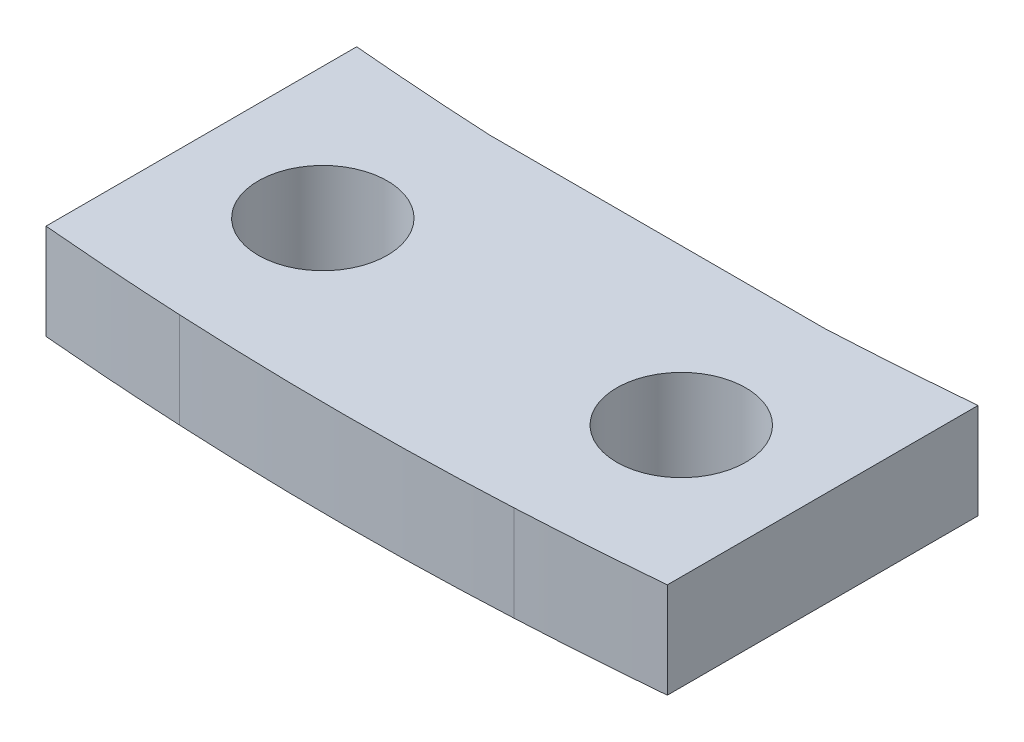
ISO-10303-21;
HEADER;
FILE_DESCRIPTION(('STEP AP214'),'2;1');
FILE_NAME('part.step','',(''),(''),'','','');
FILE_SCHEMA(('AUTOMOTIVE_DESIGN { 1 0 10303 214 1 1 1 1 }'));
ENDSEC;
DATA;
#1=APPLICATION_CONTEXT('core data for automotive mechanical design processes');
#2=APPLICATION_PROTOCOL_DEFINITION('international standard','automotive_design',2000,#1);
#3=PRODUCT_CONTEXT('',#1,'mechanical');
#4=PRODUCT('Part','Part','',(#3));
#5=PRODUCT_RELATED_PRODUCT_CATEGORY('part','',(#4));
#6=PRODUCT_DEFINITION_FORMATION('','',#4);
#7=PRODUCT_DEFINITION_CONTEXT('part definition',#1,'design');
#8=PRODUCT_DEFINITION('design','',#6,#7);
#9=PRODUCT_DEFINITION_SHAPE('','',#8);
#10=(LENGTH_UNIT() NAMED_UNIT(*) SI_UNIT(.MILLI.,.METRE.));
#11=(NAMED_UNIT(*) PLANE_ANGLE_UNIT() SI_UNIT($,.RADIAN.));
#12=(NAMED_UNIT(*) SI_UNIT($,.STERADIAN.) SOLID_ANGLE_UNIT());
#13=UNCERTAINTY_MEASURE_WITH_UNIT(LENGTH_MEASURE(1.E-05),#10,'distance_accuracy_value','');
#14=(GEOMETRIC_REPRESENTATION_CONTEXT(3) GLOBAL_UNCERTAINTY_ASSIGNED_CONTEXT((#13)) GLOBAL_UNIT_ASSIGNED_CONTEXT((#10,
#11,#12)) REPRESENTATION_CONTEXT('',''));
#15=CARTESIAN_POINT('',(0.,0.,0.));
#16=DIRECTION('',(0.,0.,1.));
#17=DIRECTION('',(1.,0.,0.));
#18=AXIS2_PLACEMENT_3D('',#15,#16,#17);
#19=CARTESIAN_POINT('',(10.0017972964317,4.,-6.68003144721731));
#20=DIRECTION('',(0.,-1.,0.));
#21=DIRECTION('',(0.,0.,-1.));
#22=AXIS2_PLACEMENT_3D('',#19,#20,#21);
#23=PLANE('',#22);
#24=CARTESIAN_POINT('',(-7.50000000000041,4.,2.53269627492614E-13));
#25=DIRECTION('',(0.,1.,0.));
#26=DIRECTION('',(0.,0.,1.));
#27=AXIS2_PLACEMENT_3D('',#24,#25,#26);
#28=CIRCLE('',#27,2.69999999999955);
#29=CARTESIAN_POINT('',(-7.50000000000041,4.,2.69999999999981));
#30=VERTEX_POINT('',#29);
#31=EDGE_CURVE('E213',#30,#30,#28,.T.);
#32=ORIENTED_EDGE('',*,*,#31,.F.);
#33=EDGE_LOOP('',(#32));
#34=FACE_BOUND('',#33,.T.);
#35=CARTESIAN_POINT('',(12.9999999999984,4.,-6.91659883285647));
#36=CARTESIAN_POINT('',(11.0025987207417,4.,-6.74133582895095));
#37=CARTESIAN_POINT('',(9.00219406974415,4.,-6.5998817526765));
#38=CARTESIAN_POINT('',(6.99999999999775,4.,-6.49999999999968));
#39=B_SPLINE_CURVE_WITH_KNOTS('',3,(#35,#36,#37,#38),.UNSPECIFIED.,.F.,.F.,(4,4),
(0.769001891352631,1.),.UNSPECIFIED.);
#40=CARTESIAN_POINT('',(12.999999999999,4.,-6.91659883285647));
#41=VERTEX_POINT('',#40);
#42=CARTESIAN_POINT('',(6.99999999999867,4.,-6.49999999999976));
#43=VERTEX_POINT('',#42);
#44=EDGE_CURVE('E218',#41,#43,#39,.T.);
#45=ORIENTED_EDGE('',*,*,#44,.T.);
#46=DIRECTION('',(-1.,0.,0.));
#47=VECTOR('',#46,1.);
#48=CARTESIAN_POINT('',(6.99999999999867,4.,-6.49999999999976));
#49=LINE('',#48,#47);
#50=CARTESIAN_POINT('',(-6.99999999999859,4.,-6.49999999999968));
#51=VERTEX_POINT('',#50);
#52=EDGE_CURVE('E96',#43,#51,#49,.T.);
#53=ORIENTED_EDGE('',*,*,#52,.T.);
#54=CARTESIAN_POINT('',(-6.99999999999859,4.,-6.49999999999968));
#55=CARTESIAN_POINT('',(-9.00219406974498,4.,-6.5998817526765));
#56=CARTESIAN_POINT('',(-11.0025987207426,4.,-6.74133582895095));
#57=CARTESIAN_POINT('',(-12.9999999999993,4.,-6.91659883285647));
#58=B_SPLINE_CURVE_WITH_KNOTS('',3,(#54,#55,#56,#57),.UNSPECIFIED.,.F.,.F.,(4,4),
(1.4770263050022E-08,0.230998108647369),.UNSPECIFIED.);
#59=CARTESIAN_POINT('',(-12.9999996139171,4.,-6.91659883267888));
#60=VERTEX_POINT('',#59);
#61=EDGE_CURVE('E165',#51,#60,#58,.T.);
#62=ORIENTED_EDGE('',*,*,#61,.T.);
#63=DIRECTION('',(2.96987209127525E-08,0.,1.));
#64=VECTOR('',#63,1.);
#65=CARTESIAN_POINT('',(-12.9999996139171,4.,-6.91659883267888));
#66=LINE('',#65,#64);
#67=CARTESIAN_POINT('',(-12.9999992278337,4.,6.08340116746181));
#68=VERTEX_POINT('',#67);
#69=EDGE_CURVE('E160',#60,#68,#66,.T.);
#70=ORIENTED_EDGE('',*,*,#69,.T.);
#71=CARTESIAN_POINT('',(-12.9999992278337,4.,6.08340116746181));
#72=CARTESIAN_POINT('',(-12.1211629849976,4.,6.16051510618814));
#73=CARTESIAN_POINT('',(-10.1223810082019,4.,6.32090639475367));
#74=CARTESIAN_POINT('',(-8.12129399453965,4.,6.44406292196125));
#75=CARTESIAN_POINT('',(-6.99999922783445,4.,6.50000000031853));
#76=B_SPLINE_CURVE_WITH_KNOTS('',3,(#71,#72,#73,#74,#75),.UNSPECIFIED.,.F.,.F.,(4,1,4),(0.,
0.439999999999999,1.),.UNSPECIFIED.);
#77=CARTESIAN_POINT('',(-6.99999922783444,4.,6.50000000031854));
#78=VERTEX_POINT('',#77);
#79=EDGE_CURVE('E115',#68,#78,#76,.T.);
#80=ORIENTED_EDGE('',*,*,#79,.T.);
#81=CARTESIAN_POINT('',(-6.99999922783444,4.,6.50000000031854));
#82=CARTESIAN_POINT('',(-6.83482132536298,4.,6.50824258978432));
#83=CARTESIAN_POINT('',(-6.66657307013336,4.,6.51634167540092));
#84=CARTESIAN_POINT('',(-5.63247488113234,4.,6.56436245256432));
#85=CARTESIAN_POINT('',(-3.7403630823661,4.,6.6350088470744));
#86=CARTESIAN_POINT('',(-1.57897075086815,4.,6.67211614631573));
#87=CARTESIAN_POINT('',(-0.278468619002596,4.,6.67607184916145));
#88=CARTESIAN_POINT('',(1.02095401136197,4.,6.67607223278273));
#89=CARTESIAN_POINT('',(3.1787726617458,4.,6.65206207836696));
#90=CARTESIAN_POINT('',(5.35042834294214,4.,6.57745990935546));
#91=CARTESIAN_POINT('',(6.6665669637553,4.,6.51634200508547));
#92=CARTESIAN_POINT('',(6.83481906783178,4.,6.50824274079084));
#93=CARTESIAN_POINT('',(7.00000000000037,4.,6.50000000000025));
#94=B_SPLINE_CURVE_WITH_KNOTS('',3,(#81,#82,#83,#84,#85,#86,#87,#88,#89,#90,#91,#92,#93),
.UNSPECIFIED.,.F.,.F.,(4,2,1,1,2,1,2,4),(0.,0.0364473066080108,0.22,0.44,0.499999692500397,
0.720000000000002,0.963552078392782,1.),.UNSPECIFIED.);
#95=CARTESIAN_POINT('',(6.99999999999921,4.,6.50000000003715));
#96=VERTEX_POINT('',#95);
#97=EDGE_CURVE('E109',#78,#96,#94,.T.);
#98=ORIENTED_EDGE('',*,*,#97,.T.);
#99=CARTESIAN_POINT('',(6.99999999999921,4.,6.50000000003715));
#100=CARTESIAN_POINT('',(7.88096539068741,4.,6.45605202885936));
#101=CARTESIAN_POINT('',(9.88237211618385,4.,6.3378784537996));
#102=CARTESIAN_POINT('',(11.881455283615,4.,6.18154844936751));
#103=CARTESIAN_POINT('',(12.9999999999984,4.,6.08340116718043));
#104=B_SPLINE_CURVE_WITH_KNOTS('',3,(#99,#100,#101,#102,#103),.UNSPECIFIED.,.F.,.F.,(4,1,4),(0.,
0.44,1.),.UNSPECIFIED.);
#105=CARTESIAN_POINT('',(12.9999999999996,4.,6.08340116714353));
#106=VERTEX_POINT('',#105);
#107=EDGE_CURVE('E113',#96,#106,#104,.T.);
#108=ORIENTED_EDGE('',*,*,#107,.T.);
#109=DIRECTION('',(0.,0.,-1.));
#110=VECTOR('',#109,1.);
#111=CARTESIAN_POINT('',(12.999999999999,4.,-6.91659883285647));
#112=LINE('',#111,#110);
#113=EDGE_CURVE('E53',#106,#41,#112,.T.);
#114=ORIENTED_EDGE('',*,*,#113,.T.);
#115=EDGE_LOOP('',(#45,#53,#62,#70,#80,#98,#108,#114));
#116=FACE_BOUND('',#115,.T.);
#117=CARTESIAN_POINT('',(7.49999999999959,4.,2.4980018054066E-13));
#118=DIRECTION('',(0.,1.,0.));
#119=DIRECTION('',(0.,0.,1.));
#120=AXIS2_PLACEMENT_3D('',#117,#118,#119);
#121=CIRCLE('',#120,2.69999999999956);
#122=CARTESIAN_POINT('',(7.49999999999959,4.,2.6999999999998));
#123=VERTEX_POINT('',#122);
#124=EDGE_CURVE('E204',#123,#123,#121,.T.);
#125=ORIENTED_EDGE('',*,*,#124,.F.);
#126=EDGE_LOOP('',(#125));
#127=FACE_BOUND('',#126,.T.);
#128=ADVANCED_FACE('F35',(#34,#116,#127),#23,.F.);
#129=CARTESIAN_POINT('',(10.0017972964317,0.,-6.68003144721731));
#130=DIRECTION('',(0.,-1.,0.));
#131=DIRECTION('',(0.,0.,-1.));
#132=AXIS2_PLACEMENT_3D('',#129,#130,#131);
#133=PLANE('',#132);
#134=CARTESIAN_POINT('',(-7.50000000000041,0.,2.53269627492614E-13));
#135=DIRECTION('',(0.,1.,0.));
#136=DIRECTION('',(0.,0.,1.));
#137=AXIS2_PLACEMENT_3D('',#134,#135,#136);
#138=CIRCLE('',#137,2.69999999999955);
#139=CARTESIAN_POINT('',(-7.50000000000041,0.,2.69999999999981));
#140=VERTEX_POINT('',#139);
#141=EDGE_CURVE('E210',#140,#140,#138,.T.);
#142=ORIENTED_EDGE('',*,*,#141,.T.);
#143=EDGE_LOOP('',(#142));
#144=FACE_BOUND('',#143,.T.);
#145=CARTESIAN_POINT('',(12.9999999999984,0.,-6.91659883285647));
#146=CARTESIAN_POINT('',(11.0025987207417,0.,-6.74133582895095));
#147=CARTESIAN_POINT('',(9.00219406974415,0.,-6.5998817526765));
#148=CARTESIAN_POINT('',(6.99999999999775,0.,-6.49999999999968));
#149=B_SPLINE_CURVE_WITH_KNOTS('',3,(#145,#146,#147,#148),.UNSPECIFIED.,.F.,.F.,(4,4),
(0.769001891352631,1.),.UNSPECIFIED.);
#150=CARTESIAN_POINT('',(12.999999999999,0.,-6.91659883285647));
#151=VERTEX_POINT('',#150);
#152=CARTESIAN_POINT('',(6.99999999999867,0.,-6.49999999999976));
#153=VERTEX_POINT('',#152);
#154=EDGE_CURVE('E216',#151,#153,#149,.T.);
#155=ORIENTED_EDGE('',*,*,#154,.F.);
#156=DIRECTION('',(0.,0.,-1.));
#157=VECTOR('',#156,1.);
#158=CARTESIAN_POINT('',(12.999999999999,0.,-6.91659883285647));
#159=LINE('',#158,#157);
#160=CARTESIAN_POINT('',(12.9999999999996,0.,6.08340116714353));
#161=VERTEX_POINT('',#160);
#162=EDGE_CURVE('E88',#161,#151,#159,.T.);
#163=ORIENTED_EDGE('',*,*,#162,.F.);
#164=CARTESIAN_POINT('',(6.99999999999921,0.,6.50000000003715));
#165=CARTESIAN_POINT('',(7.88096539068741,0.,6.45605202885936));
#166=CARTESIAN_POINT('',(9.88237211618385,0.,6.3378784537996));
#167=CARTESIAN_POINT('',(11.881455283615,0.,6.18154844936751));
#168=CARTESIAN_POINT('',(12.9999999999984,0.,6.08340116718043));
#169=B_SPLINE_CURVE_WITH_KNOTS('',3,(#164,#165,#166,#167,#168),.UNSPECIFIED.,.F.,.F.,(4,1,4),
(0.,0.44,1.),.UNSPECIFIED.);
#170=CARTESIAN_POINT('',(6.99999999999921,0.,6.50000000003715));
#171=VERTEX_POINT('',#170);
#172=EDGE_CURVE('E82',#171,#161,#169,.T.);
#173=ORIENTED_EDGE('',*,*,#172,.F.);
#174=CARTESIAN_POINT('',(-6.99999922783444,0.,6.50000000031854));
#175=CARTESIAN_POINT('',(-6.83482132536298,0.,6.50824258978432));
#176=CARTESIAN_POINT('',(-6.66657307013336,0.,6.51634167540092));
#177=CARTESIAN_POINT('',(-5.63247488113234,0.,6.56436245256432));
#178=CARTESIAN_POINT('',(-3.7403630823661,0.,6.6350088470744));
#179=CARTESIAN_POINT('',(-1.57897075086815,0.,6.67211614631573));
#180=CARTESIAN_POINT('',(-0.278468619002596,0.,6.67607184916145));
#181=CARTESIAN_POINT('',(1.02095401136197,0.,6.67607223278273));
#182=CARTESIAN_POINT('',(3.1787726617458,0.,6.65206207836696));
#183=CARTESIAN_POINT('',(5.35042834294214,0.,6.57745990935546));
#184=CARTESIAN_POINT('',(6.6665669637553,0.,6.51634200508547));
#185=CARTESIAN_POINT('',(6.83481906783178,0.,6.50824274079084));
#186=CARTESIAN_POINT('',(7.00000000000037,0.,6.50000000000025));
#187=B_SPLINE_CURVE_WITH_KNOTS('',3,(#174,#175,#176,#177,#178,#179,#180,#181,#182,#183,#184,
#185,#186),.UNSPECIFIED.,.F.,.F.,(4,2,1,1,2,1,2,4),(0.,0.0364473066080108,0.22,0.44,
0.499999692500397,0.720000000000002,0.963552078392782,1.),.UNSPECIFIED.);
#188=CARTESIAN_POINT('',(-6.99999922783444,0.,6.50000000031854));
#189=VERTEX_POINT('',#188);
#190=EDGE_CURVE('E123',#189,#171,#187,.T.);
#191=ORIENTED_EDGE('',*,*,#190,.F.);
#192=CARTESIAN_POINT('',(-12.9999992278337,0.,6.08340116746181));
#193=CARTESIAN_POINT('',(-12.1211629849976,0.,6.16051510618814));
#194=CARTESIAN_POINT('',(-10.1223810082019,0.,6.32090639475367));
#195=CARTESIAN_POINT('',(-8.12129399453965,0.,6.44406292196125));
#196=CARTESIAN_POINT('',(-6.99999922783445,0.,6.50000000031853));
#197=B_SPLINE_CURVE_WITH_KNOTS('',3,(#192,#193,#194,#195,#196),.UNSPECIFIED.,.F.,.F.,(4,1,4),
(0.,0.439999999999999,1.),.UNSPECIFIED.);
#198=CARTESIAN_POINT('',(-12.9999992278337,0.,6.08340116746181));
#199=VERTEX_POINT('',#198);
#200=EDGE_CURVE('E253',#199,#189,#197,.T.);
#201=ORIENTED_EDGE('',*,*,#200,.F.);
#202=DIRECTION('',(2.96987209127525E-08,0.,1.));
#203=VECTOR('',#202,1.);
#204=CARTESIAN_POINT('',(-12.9999996139171,0.,-6.91659883267888));
#205=LINE('',#204,#203);
#206=CARTESIAN_POINT('',(-12.9999996139171,0.,-6.91659883267888));
#207=VERTEX_POINT('',#206);
#208=EDGE_CURVE('E251',#207,#199,#205,.T.);
#209=ORIENTED_EDGE('',*,*,#208,.F.);
#210=CARTESIAN_POINT('',(-6.99999999999859,0.,-6.49999999999968));
#211=CARTESIAN_POINT('',(-9.00219406974498,0.,-6.5998817526765));
#212=CARTESIAN_POINT('',(-11.0025987207426,0.,-6.74133582895095));
#213=CARTESIAN_POINT('',(-12.9999999999993,0.,-6.91659883285647));
#214=B_SPLINE_CURVE_WITH_KNOTS('',3,(#210,#211,#212,#213),.UNSPECIFIED.,.F.,.F.,(4,4),
(1.4770263050022E-08,0.230998108647369),.UNSPECIFIED.);
#215=CARTESIAN_POINT('',(-6.99999999999859,0.,-6.49999999999968));
#216=VERTEX_POINT('',#215);
#217=EDGE_CURVE('E245',#216,#207,#214,.T.);
#218=ORIENTED_EDGE('',*,*,#217,.F.);
#219=DIRECTION('',(-1.,0.,0.));
#220=VECTOR('',#219,1.);
#221=CARTESIAN_POINT('',(6.99999999999867,0.,-6.49999999999976));
#222=LINE('',#221,#220);
#223=EDGE_CURVE('E249',#153,#216,#222,.T.);
#224=ORIENTED_EDGE('',*,*,#223,.F.);
#225=EDGE_LOOP('',(#155,#163,#173,#191,#201,#209,#218,#224));
#226=FACE_BOUND('',#225,.T.);
#227=CARTESIAN_POINT('',(7.49999999999959,0.,2.4980018054066E-13));
#228=DIRECTION('',(0.,1.,0.));
#229=DIRECTION('',(0.,0.,1.));
#230=AXIS2_PLACEMENT_3D('',#227,#228,#229);
#231=CIRCLE('',#230,2.69999999999956);
#232=CARTESIAN_POINT('',(7.49999999999959,0.,2.6999999999998));
#233=VERTEX_POINT('',#232);
#234=EDGE_CURVE('E207',#233,#233,#231,.T.);
#235=ORIENTED_EDGE('',*,*,#234,.T.);
#236=EDGE_LOOP('',(#235));
#237=FACE_BOUND('',#236,.T.);
#238=ADVANCED_FACE('F181',(#144,#226,#237),#133,.T.);
#239=DIRECTION('',(0.,-1.,0.));
#240=VECTOR('',#239,1.);
#241=SURFACE_OF_LINEAR_EXTRUSION('',#39,#240);
#242=ORIENTED_EDGE('',*,*,#154,.T.);
#243=DIRECTION('',(0.,-1.,0.));
#244=VECTOR('',#243,1.);
#245=CARTESIAN_POINT('',(6.99999999999867,4.,-6.49999999999976));
#246=LINE('',#245,#244);
#247=EDGE_CURVE('E11',#43,#153,#246,.T.);
#248=ORIENTED_EDGE('',*,*,#247,.F.);
#249=ORIENTED_EDGE('',*,*,#44,.F.);
#250=DIRECTION('',(0.,-1.,0.));
#251=VECTOR('',#250,1.);
#252=CARTESIAN_POINT('',(12.999999999999,4.,-6.91659883285647));
#253=LINE('',#252,#251);
#254=EDGE_CURVE('E129',#41,#151,#253,.T.);
#255=ORIENTED_EDGE('',*,*,#254,.T.);
#256=EDGE_LOOP('',(#242,#248,#249,#255));
#257=FACE_BOUND('',#256,.T.);
#258=ADVANCED_FACE('F37',(#257),#241,.F.);
#259=CARTESIAN_POINT('',(6.99999999999867,4.,-6.49999999999976));
#260=DIRECTION('',(0.,0.,1.));
#261=DIRECTION('',(1.,0.,0.));
#262=AXIS2_PLACEMENT_3D('',#259,#260,#261);
#263=PLANE('',#262);
#264=ORIENTED_EDGE('',*,*,#223,.T.);
#265=DIRECTION('',(0.,-1.,0.));
#266=VECTOR('',#265,1.);
#267=CARTESIAN_POINT('',(-6.99999999999859,4.,-6.49999999999968));
#268=LINE('',#267,#266);
#269=EDGE_CURVE('E45',#51,#216,#268,.T.);
#270=ORIENTED_EDGE('',*,*,#269,.F.);
#271=ORIENTED_EDGE('',*,*,#52,.F.);
#272=ORIENTED_EDGE('',*,*,#247,.T.);
#273=EDGE_LOOP('',(#264,#270,#271,#272));
#274=FACE_BOUND('',#273,.T.);
#275=ADVANCED_FACE('F175',(#274),#263,.F.);
#276=DIRECTION('',(0.,-1.,0.));
#277=VECTOR('',#276,1.);
#278=SURFACE_OF_LINEAR_EXTRUSION('',#58,#277);
#279=ORIENTED_EDGE('',*,*,#217,.T.);
#280=DIRECTION('',(0.,-1.,0.));
#281=VECTOR('',#280,1.);
#282=CARTESIAN_POINT('',(-12.9999996139171,4.,-6.91659883267888));
#283=LINE('',#282,#281);
#284=EDGE_CURVE('E239',#60,#207,#283,.T.);
#285=ORIENTED_EDGE('',*,*,#284,.F.);
#286=ORIENTED_EDGE('',*,*,#61,.F.);
#287=ORIENTED_EDGE('',*,*,#269,.T.);
#288=EDGE_LOOP('',(#279,#285,#286,#287));
#289=FACE_BOUND('',#288,.T.);
#290=ADVANCED_FACE('F173',(#289),#278,.F.);
#291=CARTESIAN_POINT('',(-12.9999996139171,4.,-6.91659883267888));
#292=DIRECTION('',(1.,0.,-2.96987209127525E-08));
#293=DIRECTION('',(-2.96987209127525E-08,0.,-1.));
#294=AXIS2_PLACEMENT_3D('',#291,#292,#293);
#295=PLANE('',#294);
#296=ORIENTED_EDGE('',*,*,#208,.T.);
#297=DIRECTION('',(0.,-1.,0.));
#298=VECTOR('',#297,1.);
#299=CARTESIAN_POINT('',(-12.9999992278337,4.,6.08340116746181));
#300=LINE('',#299,#298);
#301=EDGE_CURVE('E236',#68,#199,#300,.T.);
#302=ORIENTED_EDGE('',*,*,#301,.F.);
#303=ORIENTED_EDGE('',*,*,#69,.F.);
#304=ORIENTED_EDGE('',*,*,#284,.T.);
#305=EDGE_LOOP('',(#296,#302,#303,#304));
#306=FACE_BOUND('',#305,.T.);
#307=ADVANCED_FACE('F153',(#306),#295,.F.);
#308=DIRECTION('',(0.,-1.,0.));
#309=VECTOR('',#308,1.);
#310=SURFACE_OF_LINEAR_EXTRUSION('',#76,#309);
#311=ORIENTED_EDGE('',*,*,#200,.T.);
#312=DIRECTION('',(0.,-1.,0.));
#313=VECTOR('',#312,1.);
#314=CARTESIAN_POINT('',(-6.99999922783444,4.,6.50000000031854));
#315=LINE('',#314,#313);
#316=EDGE_CURVE('E124',#78,#189,#315,.T.);
#317=ORIENTED_EDGE('',*,*,#316,.F.);
#318=ORIENTED_EDGE('',*,*,#79,.F.);
#319=ORIENTED_EDGE('',*,*,#301,.T.);
#320=EDGE_LOOP('',(#311,#317,#318,#319));
#321=FACE_BOUND('',#320,.T.);
#322=ADVANCED_FACE('F150',(#321),#310,.F.);
#323=DIRECTION('',(0.,-1.,0.));
#324=VECTOR('',#323,1.);
#325=SURFACE_OF_LINEAR_EXTRUSION('',#94,#324);
#326=ORIENTED_EDGE('',*,*,#190,.T.);
#327=DIRECTION('',(0.,-1.,0.));
#328=VECTOR('',#327,1.);
#329=CARTESIAN_POINT('',(6.99999999999921,4.,6.50000000003715));
#330=LINE('',#329,#328);
#331=EDGE_CURVE('E120',#96,#171,#330,.T.);
#332=ORIENTED_EDGE('',*,*,#331,.F.);
#333=ORIENTED_EDGE('',*,*,#97,.F.);
#334=ORIENTED_EDGE('',*,*,#316,.T.);
#335=EDGE_LOOP('',(#326,#332,#333,#334));
#336=FACE_BOUND('',#335,.T.);
#337=ADVANCED_FACE('F121',(#336),#325,.F.);
#338=DIRECTION('',(0.,-1.,0.));
#339=VECTOR('',#338,1.);
#340=SURFACE_OF_LINEAR_EXTRUSION('',#104,#339);
#341=ORIENTED_EDGE('',*,*,#172,.T.);
#342=DIRECTION('',(0.,-1.,0.));
#343=VECTOR('',#342,1.);
#344=CARTESIAN_POINT('',(12.9999999999996,4.,6.08340116714353));
#345=LINE('',#344,#343);
#346=EDGE_CURVE('E125',#106,#161,#345,.T.);
#347=ORIENTED_EDGE('',*,*,#346,.F.);
#348=ORIENTED_EDGE('',*,*,#107,.F.);
#349=ORIENTED_EDGE('',*,*,#331,.T.);
#350=EDGE_LOOP('',(#341,#347,#348,#349));
#351=FACE_BOUND('',#350,.T.);
#352=ADVANCED_FACE('F127',(#351),#340,.F.);
#353=CARTESIAN_POINT('',(12.999999999999,4.,-6.91659883285647));
#354=DIRECTION('',(-1.,0.,0.));
#355=DIRECTION('',(0.,0.,1.));
#356=AXIS2_PLACEMENT_3D('',#353,#354,#355);
#357=PLANE('',#356);
#358=ORIENTED_EDGE('',*,*,#162,.T.);
#359=ORIENTED_EDGE('',*,*,#254,.F.);
#360=ORIENTED_EDGE('',*,*,#113,.F.);
#361=ORIENTED_EDGE('',*,*,#346,.T.);
#362=EDGE_LOOP('',(#358,#359,#360,#361));
#363=FACE_BOUND('',#362,.T.);
#364=ADVANCED_FACE('F146',(#363),#357,.F.);
#365=CARTESIAN_POINT('',(-7.50000000000041,4.,2.53269627492614E-13));
#366=DIRECTION('',(0.,-1.,0.));
#367=DIRECTION('',(0.,0.,-1.));
#368=AXIS2_PLACEMENT_3D('',#365,#366,#367);
#369=CYLINDRICAL_SURFACE('',#368,2.69999999999955);
#370=ORIENTED_EDGE('',*,*,#31,.T.);
#371=EDGE_LOOP('',(#370));
#372=FACE_BOUND('',#371,.T.);
#373=ORIENTED_EDGE('',*,*,#141,.F.);
#374=EDGE_LOOP('',(#373));
#375=FACE_BOUND('',#374,.T.);
#376=ADVANCED_FACE('F192',(#372,#375),#369,.F.);
#377=CARTESIAN_POINT('',(7.49999999999959,4.,2.4980018054066E-13));
#378=DIRECTION('',(0.,-1.,0.));
#379=DIRECTION('',(0.,0.,-1.));
#380=AXIS2_PLACEMENT_3D('',#377,#378,#379);
#381=CYLINDRICAL_SURFACE('',#380,2.69999999999956);
#382=ORIENTED_EDGE('',*,*,#124,.T.);
#383=EDGE_LOOP('',(#382));
#384=FACE_BOUND('',#383,.T.);
#385=ORIENTED_EDGE('',*,*,#234,.F.);
#386=EDGE_LOOP('',(#385));
#387=FACE_BOUND('',#386,.T.);
#388=ADVANCED_FACE('F195',(#384,#387),#381,.F.);
#389=CLOSED_SHELL('',(#128,#238,#258,#275,#290,#307,#322,#337,#352,#364,#376,#388));
#390=MANIFOLD_SOLID_BREP('B2',#389);
#391=ADVANCED_BREP_SHAPE_REPRESENTATION('',(#18,#390),#14);
#392=SHAPE_DEFINITION_REPRESENTATION(#9,#391);
ENDSEC;
END-ISO-10303-21;
